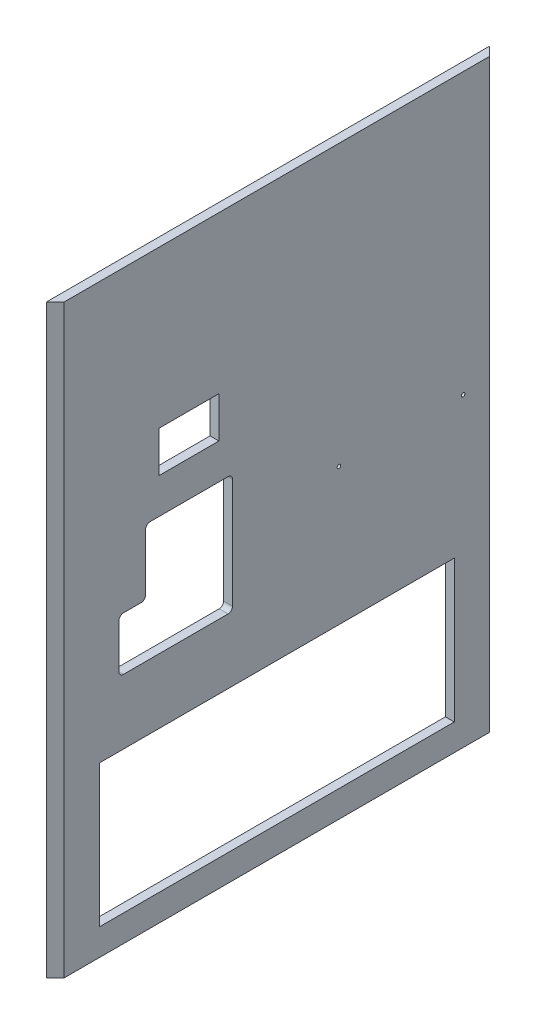
ISO-10303-21;
HEADER;
FILE_DESCRIPTION(('STEP AP214'),'2;1');
FILE_NAME('part.step','',(''),(''),'','','');
FILE_SCHEMA(('AUTOMOTIVE_DESIGN { 1 0 10303 214 1 1 1 1 }'));
ENDSEC;
DATA;
#1=APPLICATION_CONTEXT('core data for automotive mechanical design processes');
#2=APPLICATION_PROTOCOL_DEFINITION('international standard','automotive_design',2000,#1);
#3=PRODUCT_CONTEXT('',#1,'mechanical');
#4=PRODUCT('Part','Part','',(#3));
#5=PRODUCT_RELATED_PRODUCT_CATEGORY('part','',(#4));
#6=PRODUCT_DEFINITION_FORMATION('','',#4);
#7=PRODUCT_DEFINITION_CONTEXT('part definition',#1,'design');
#8=PRODUCT_DEFINITION('design','',#6,#7);
#9=PRODUCT_DEFINITION_SHAPE('','',#8);
#10=(LENGTH_UNIT() NAMED_UNIT(*) SI_UNIT(.MILLI.,.METRE.));
#11=(NAMED_UNIT(*) PLANE_ANGLE_UNIT() SI_UNIT($,.RADIAN.));
#12=(NAMED_UNIT(*) SI_UNIT($,.STERADIAN.) SOLID_ANGLE_UNIT());
#13=UNCERTAINTY_MEASURE_WITH_UNIT(LENGTH_MEASURE(1.E-05),#10,'distance_accuracy_value','');
#14=(GEOMETRIC_REPRESENTATION_CONTEXT(3) GLOBAL_UNCERTAINTY_ASSIGNED_CONTEXT((#13)) GLOBAL_UNIT_ASSIGNED_CONTEXT((#10,
#11,#12)) REPRESENTATION_CONTEXT('',''));
#15=CARTESIAN_POINT('',(0.,0.,0.));
#16=DIRECTION('',(0.,0.,1.));
#17=DIRECTION('',(1.,0.,0.));
#18=AXIS2_PLACEMENT_3D('',#15,#16,#17);
#19=CARTESIAN_POINT('',(0.,330.,0.));
#20=DIRECTION('',(-1.,0.,0.));
#21=DIRECTION('',(0.,0.,1.));
#22=AXIS2_PLACEMENT_3D('',#19,#20,#21);
#23=PLANE('',#22);
#24=CARTESIAN_POINT('',(0.,172.2,-230.));
#25=DIRECTION('',(-1.,0.,0.));
#26=DIRECTION('',(0.,0.,1.));
#27=AXIS2_PLACEMENT_3D('',#24,#25,#26);
#28=CIRCLE('',#27,0.999999999999998);
#29=CARTESIAN_POINT('',(0.,172.2,-229.));
#30=VERTEX_POINT('',#29);
#31=EDGE_CURVE('E227',#30,#30,#28,.F.);
#32=ORIENTED_EDGE('',*,*,#31,.F.);
#33=EDGE_LOOP('',(#32));
#34=FACE_BOUND('',#33,.T.);
#35=CARTESIAN_POINT('',(0.,172.2,-160.));
#36=DIRECTION('',(-1.,0.,0.));
#37=DIRECTION('',(0.,0.,1.));
#38=AXIS2_PLACEMENT_3D('',#35,#36,#37);
#39=CIRCLE('',#38,0.999999999999998);
#40=CARTESIAN_POINT('',(0.,172.2,-159.));
#41=VERTEX_POINT('',#40);
#42=EDGE_CURVE('E220',#41,#41,#39,.F.);
#43=ORIENTED_EDGE('',*,*,#42,.F.);
#44=EDGE_LOOP('',(#43));
#45=FACE_BOUND('',#44,.T.);
#46=DIRECTION('',(0.,0.,1.));
#47=VECTOR('',#46,1.);
#48=CARTESIAN_POINT('',(0.,218.5,-92.3500000000001));
#49=LINE('',#48,#47);
#50=CARTESIAN_POINT('',(0.,218.5,-92.3500000000001));
#51=VERTEX_POINT('',#50);
#52=CARTESIAN_POINT('',(0.,218.5,-58.6500000000001));
#53=VERTEX_POINT('',#52);
#54=EDGE_CURVE('E205',#51,#53,#49,.T.);
#55=ORIENTED_EDGE('',*,*,#54,.T.);
#56=DIRECTION('',(0.,1.,0.));
#57=VECTOR('',#56,1.);
#58=CARTESIAN_POINT('',(0.,218.5,-58.6500000000001));
#59=LINE('',#58,#57);
#60=CARTESIAN_POINT('',(0.,241.6,-58.6500000000001));
#61=VERTEX_POINT('',#60);
#62=EDGE_CURVE('E199',#53,#61,#59,.T.);
#63=ORIENTED_EDGE('',*,*,#62,.T.);
#64=DIRECTION('',(0.,0.,-1.));
#65=VECTOR('',#64,1.);
#66=CARTESIAN_POINT('',(0.,241.6,-58.6500000000001));
#67=LINE('',#66,#65);
#68=CARTESIAN_POINT('',(0.,241.6,-92.3500000000001));
#69=VERTEX_POINT('',#68);
#70=EDGE_CURVE('E208',#61,#69,#67,.T.);
#71=ORIENTED_EDGE('',*,*,#70,.T.);
#72=DIRECTION('',(0.,-1.,0.));
#73=VECTOR('',#72,1.);
#74=CARTESIAN_POINT('',(0.,241.6,-92.3500000000001));
#75=LINE('',#74,#73);
#76=EDGE_CURVE('E52',#69,#51,#75,.T.);
#77=ORIENTED_EDGE('',*,*,#76,.T.);
#78=EDGE_LOOP('',(#55,#63,#71,#77));
#79=FACE_BOUND('',#78,.T.);
#80=DIRECTION('',(0.,0.,-1.));
#81=VECTOR('',#80,1.);
#82=CARTESIAN_POINT('',(0.,161.5,-36.0000000000001));
#83=LINE('',#82,#81);
#84=CARTESIAN_POINT('',(0.,161.5,-38.5000000000001));
#85=VERTEX_POINT('',#84);
#86=CARTESIAN_POINT('',(0.,161.5,-48.5000000000001));
#87=VERTEX_POINT('',#86);
#88=EDGE_CURVE('E244',#85,#87,#83,.T.);
#89=ORIENTED_EDGE('',*,*,#88,.T.);
#90=CARTESIAN_POINT('',(0.,164.,-48.5000000000001));
#91=DIRECTION('',(-1.,0.,0.));
#92=DIRECTION('',(0.,0.,1.));
#93=AXIS2_PLACEMENT_3D('',#90,#91,#92);
#94=CIRCLE('',#93,2.5);
#95=CARTESIAN_POINT('',(0.,164.,-51.0000000000001));
#96=VERTEX_POINT('',#95);
#97=EDGE_CURVE('E360',#87,#96,#94,.F.);
#98=ORIENTED_EDGE('',*,*,#97,.T.);
#99=DIRECTION('',(0.,1.,0.));
#100=VECTOR('',#99,1.);
#101=CARTESIAN_POINT('',(0.,198.5,-51.0000000000001));
#102=LINE('',#101,#100);
#103=CARTESIAN_POINT('',(0.,196.,-51.0000000000001));
#104=VERTEX_POINT('',#103);
#105=EDGE_CURVE('E247',#96,#104,#102,.T.);
#106=ORIENTED_EDGE('',*,*,#105,.T.);
#107=CARTESIAN_POINT('',(0.,196.,-53.5000000000001));
#108=DIRECTION('',(-1.,0.,0.));
#109=DIRECTION('',(0.,0.,1.));
#110=AXIS2_PLACEMENT_3D('',#107,#108,#109);
#111=CIRCLE('',#110,2.5);
#112=CARTESIAN_POINT('',(0.,198.5,-53.5000000000001));
#113=VERTEX_POINT('',#112);
#114=EDGE_CURVE('E377',#104,#113,#111,.T.);
#115=ORIENTED_EDGE('',*,*,#114,.T.);
#116=DIRECTION('',(0.,0.,-1.));
#117=VECTOR('',#116,1.);
#118=CARTESIAN_POINT('',(0.,198.5,-100.));
#119=LINE('',#118,#117);
#120=CARTESIAN_POINT('',(0.,198.5,-97.5000000000001));
#121=VERTEX_POINT('',#120);
#122=EDGE_CURVE('E250',#113,#121,#119,.T.);
#123=ORIENTED_EDGE('',*,*,#122,.T.);
#124=CARTESIAN_POINT('',(0.,196.,-97.5000000000001));
#125=DIRECTION('',(-1.,0.,0.));
#126=DIRECTION('',(0.,0.,1.));
#127=AXIS2_PLACEMENT_3D('',#124,#125,#126);
#128=CIRCLE('',#127,2.5);
#129=CARTESIAN_POINT('',(0.,196.,-100.));
#130=VERTEX_POINT('',#129);
#131=EDGE_CURVE('E373',#121,#130,#128,.T.);
#132=ORIENTED_EDGE('',*,*,#131,.T.);
#133=DIRECTION('',(0.,-1.,0.));
#134=VECTOR('',#133,1.);
#135=CARTESIAN_POINT('',(0.,198.5,-100.));
#136=LINE('',#135,#134);
#137=CARTESIAN_POINT('',(0.,134.,-100.));
#138=VERTEX_POINT('',#137);
#139=EDGE_CURVE('E253',#130,#138,#136,.T.);
#140=ORIENTED_EDGE('',*,*,#139,.T.);
#141=CARTESIAN_POINT('',(0.,134.,-97.5));
#142=DIRECTION('',(-1.,0.,0.));
#143=DIRECTION('',(0.,0.,1.));
#144=AXIS2_PLACEMENT_3D('',#141,#142,#143);
#145=CIRCLE('',#144,2.5);
#146=CARTESIAN_POINT('',(0.,131.5,-97.5));
#147=VERTEX_POINT('',#146);
#148=EDGE_CURVE('E369',#138,#147,#145,.T.);
#149=ORIENTED_EDGE('',*,*,#148,.T.);
#150=DIRECTION('',(0.,0.,1.));
#151=VECTOR('',#150,1.);
#152=CARTESIAN_POINT('',(0.,131.5,-100.));
#153=LINE('',#152,#151);
#154=CARTESIAN_POINT('',(0.,131.5,-38.5000000000001));
#155=VERTEX_POINT('',#154);
#156=EDGE_CURVE('E237',#147,#155,#153,.T.);
#157=ORIENTED_EDGE('',*,*,#156,.T.);
#158=CARTESIAN_POINT('',(0.,134.,-38.5000000000001));
#159=DIRECTION('',(-1.,0.,0.));
#160=DIRECTION('',(0.,0.,1.));
#161=AXIS2_PLACEMENT_3D('',#158,#159,#160);
#162=CIRCLE('',#161,2.5);
#163=CARTESIAN_POINT('',(0.,134.,-36.0000000000001));
#164=VERTEX_POINT('',#163);
#165=EDGE_CURVE('E11',#155,#164,#162,.T.);
#166=ORIENTED_EDGE('',*,*,#165,.T.);
#167=DIRECTION('',(0.,1.,0.));
#168=VECTOR('',#167,1.);
#169=CARTESIAN_POINT('',(0.,131.5,-36.0000000000001));
#170=LINE('',#169,#168);
#171=CARTESIAN_POINT('',(0.,159.,-36.0000000000001));
#172=VERTEX_POINT('',#171);
#173=EDGE_CURVE('E240',#164,#172,#170,.T.);
#174=ORIENTED_EDGE('',*,*,#173,.T.);
#175=CARTESIAN_POINT('',(0.,159.,-38.5000000000001));
#176=DIRECTION('',(-1.,0.,0.));
#177=DIRECTION('',(0.,0.,1.));
#178=AXIS2_PLACEMENT_3D('',#175,#176,#177);
#179=CIRCLE('',#178,2.5);
#180=EDGE_CURVE('E381',#172,#85,#179,.T.);
#181=ORIENTED_EDGE('',*,*,#180,.T.);
#182=EDGE_LOOP('',(#89,#98,#106,#115,#123,#132,#140,#149,#157,#166,#174,#181));
#183=FACE_BOUND('',#182,.T.);
#184=DIRECTION('',(0.,1.,0.));
#185=VECTOR('',#184,1.);
#186=CARTESIAN_POINT('',(0.,15.,-225.));
#187=LINE('',#186,#185);
#188=CARTESIAN_POINT('',(0.,15.,-225.));
#189=VERTEX_POINT('',#188);
#190=CARTESIAN_POINT('',(0.,95.,-225.));
#191=VERTEX_POINT('',#190);
#192=EDGE_CURVE('E274',#189,#191,#187,.T.);
#193=ORIENTED_EDGE('',*,*,#192,.F.);
#194=DIRECTION('',(0.,0.,-1.));
#195=VECTOR('',#194,1.);
#196=CARTESIAN_POINT('',(0.,15.,-25.));
#197=LINE('',#196,#195);
#198=CARTESIAN_POINT('',(0.,15.,-25.));
#199=VERTEX_POINT('',#198);
#200=EDGE_CURVE('E277',#199,#189,#197,.T.);
#201=ORIENTED_EDGE('',*,*,#200,.F.);
#202=DIRECTION('',(0.,-1.,0.));
#203=VECTOR('',#202,1.);
#204=CARTESIAN_POINT('',(0.,95.,-25.));
#205=LINE('',#204,#203);
#206=CARTESIAN_POINT('',(0.,95.,-25.));
#207=VERTEX_POINT('',#206);
#208=EDGE_CURVE('E294',#207,#199,#205,.T.);
#209=ORIENTED_EDGE('',*,*,#208,.F.);
#210=DIRECTION('',(0.,0.,1.));
#211=VECTOR('',#210,1.);
#212=CARTESIAN_POINT('',(0.,95.,-225.));
#213=LINE('',#212,#211);
#214=EDGE_CURVE('E256',#191,#207,#213,.T.);
#215=ORIENTED_EDGE('',*,*,#214,.F.);
#216=EDGE_LOOP('',(#193,#201,#209,#215));
#217=FACE_BOUND('',#216,.T.);
#218=DIRECTION('',(0.,0.,-1.));
#219=VECTOR('',#218,1.);
#220=CARTESIAN_POINT('',(0.,0.,0.));
#221=LINE('',#220,#219);
#222=CARTESIAN_POINT('',(0.,0.,-5.));
#223=VERTEX_POINT('',#222);
#224=CARTESIAN_POINT('',(0.,0.,-245.));
#225=VERTEX_POINT('',#224);
#226=EDGE_CURVE('E312',#223,#225,#221,.T.);
#227=ORIENTED_EDGE('',*,*,#226,.T.);
#228=DIRECTION('',(0.,1.,0.));
#229=VECTOR('',#228,1.);
#230=CARTESIAN_POINT('',(0.,-0.000999999999973245,-245.));
#231=LINE('',#230,#229);
#232=CARTESIAN_POINT('',(0.,330.,-245.));
#233=VERTEX_POINT('',#232);
#234=EDGE_CURVE('E306',#225,#233,#231,.T.);
#235=ORIENTED_EDGE('',*,*,#234,.T.);
#236=DIRECTION('',(0.,0.,-1.));
#237=VECTOR('',#236,1.);
#238=CARTESIAN_POINT('',(0.,330.,0.));
#239=LINE('',#238,#237);
#240=CARTESIAN_POINT('',(0.,330.,-5.));
#241=VERTEX_POINT('',#240);
#242=EDGE_CURVE('E317',#241,#233,#239,.T.);
#243=ORIENTED_EDGE('',*,*,#242,.F.);
#244=DIRECTION('',(0.,1.,0.));
#245=VECTOR('',#244,1.);
#246=CARTESIAN_POINT('',(0.,-0.000999999999973245,-5.));
#247=LINE('',#246,#245);
#248=EDGE_CURVE('E307',#223,#241,#247,.T.);
#249=ORIENTED_EDGE('',*,*,#248,.F.);
#250=EDGE_LOOP('',(#227,#235,#243,#249));
#251=FACE_BOUND('',#250,.T.);
#252=ADVANCED_FACE('F37',(#34,#45,#79,#183,#217,#251),#23,.F.);
#253=CARTESIAN_POINT('',(-5.,330.,-250.));
#254=DIRECTION('',(1.,0.,0.));
#255=DIRECTION('',(0.,0.,-1.));
#256=AXIS2_PLACEMENT_3D('',#253,#254,#255);
#257=PLANE('',#256);
#258=CARTESIAN_POINT('',(-5.,172.2,-230.));
#259=DIRECTION('',(-1.,0.,0.));
#260=DIRECTION('',(0.,0.,1.));
#261=AXIS2_PLACEMENT_3D('',#258,#259,#260);
#262=CIRCLE('',#261,0.999999999999998);
#263=CARTESIAN_POINT('',(-5.,172.2,-229.));
#264=VERTEX_POINT('',#263);
#265=EDGE_CURVE('E523',#264,#264,#262,.T.);
#266=ORIENTED_EDGE('',*,*,#265,.F.);
#267=EDGE_LOOP('',(#266));
#268=FACE_BOUND('',#267,.T.);
#269=CARTESIAN_POINT('',(-4.99999999999999,172.2,-160.));
#270=DIRECTION('',(-1.,0.,0.));
#271=DIRECTION('',(0.,0.,1.));
#272=AXIS2_PLACEMENT_3D('',#269,#270,#271);
#273=CIRCLE('',#272,0.999999999999998);
#274=CARTESIAN_POINT('',(-4.99999999999999,172.2,-159.));
#275=VERTEX_POINT('',#274);
#276=EDGE_CURVE('E527',#275,#275,#273,.T.);
#277=ORIENTED_EDGE('',*,*,#276,.F.);
#278=EDGE_LOOP('',(#277));
#279=FACE_BOUND('',#278,.T.);
#280=DIRECTION('',(0.,0.,-1.));
#281=VECTOR('',#280,1.);
#282=CARTESIAN_POINT('',(-4.99999999999998,241.6,-58.6500000000001));
#283=LINE('',#282,#281);
#284=CARTESIAN_POINT('',(-4.99999999999998,241.6,-58.6500000000001));
#285=VERTEX_POINT('',#284);
#286=CARTESIAN_POINT('',(-4.99999999999998,241.6,-92.3500000000001));
#287=VERTEX_POINT('',#286);
#288=EDGE_CURVE('E226',#285,#287,#283,.T.);
#289=ORIENTED_EDGE('',*,*,#288,.F.);
#290=DIRECTION('',(0.,1.,0.));
#291=VECTOR('',#290,1.);
#292=CARTESIAN_POINT('',(-4.99999999999998,218.5,-58.6500000000001));
#293=LINE('',#292,#291);
#294=CARTESIAN_POINT('',(-4.99999999999998,218.5,-58.6500000000001));
#295=VERTEX_POINT('',#294);
#296=EDGE_CURVE('E60',#295,#285,#293,.T.);
#297=ORIENTED_EDGE('',*,*,#296,.F.);
#298=DIRECTION('',(0.,0.,1.));
#299=VECTOR('',#298,1.);
#300=CARTESIAN_POINT('',(-4.99999999999998,218.5,-92.3500000000001));
#301=LINE('',#300,#299);
#302=CARTESIAN_POINT('',(-4.99999999999998,218.5,-92.3500000000001));
#303=VERTEX_POINT('',#302);
#304=EDGE_CURVE('E214',#303,#295,#301,.T.);
#305=ORIENTED_EDGE('',*,*,#304,.F.);
#306=DIRECTION('',(0.,-1.,0.));
#307=VECTOR('',#306,1.);
#308=CARTESIAN_POINT('',(-4.99999999999998,241.6,-92.3500000000001));
#309=LINE('',#308,#307);
#310=EDGE_CURVE('E217',#287,#303,#309,.T.);
#311=ORIENTED_EDGE('',*,*,#310,.F.);
#312=EDGE_LOOP('',(#289,#297,#305,#311));
#313=FACE_BOUND('',#312,.T.);
#314=DIRECTION('',(0.,1.,0.));
#315=VECTOR('',#314,1.);
#316=CARTESIAN_POINT('',(-4.99999999999998,198.5,-51.0000000000001));
#317=LINE('',#316,#315);
#318=CARTESIAN_POINT('',(-4.99999999999998,164.,-51.0000000000001));
#319=VERTEX_POINT('',#318);
#320=CARTESIAN_POINT('',(-4.99999999999998,196.,-51.0000000000001));
#321=VERTEX_POINT('',#320);
#322=EDGE_CURVE('E265',#319,#321,#317,.T.);
#323=ORIENTED_EDGE('',*,*,#322,.F.);
#324=CARTESIAN_POINT('',(-4.99999999999998,164.,-48.5000000000001));
#325=DIRECTION('',(1.,0.,0.));
#326=DIRECTION('',(0.,0.,-1.));
#327=AXIS2_PLACEMENT_3D('',#324,#325,#326);
#328=CIRCLE('',#327,2.5);
#329=CARTESIAN_POINT('',(-4.99999999999998,161.5,-48.5000000000001));
#330=VERTEX_POINT('',#329);
#331=EDGE_CURVE('E353',#319,#330,#328,.F.);
#332=ORIENTED_EDGE('',*,*,#331,.T.);
#333=DIRECTION('',(0.,0.,-1.));
#334=VECTOR('',#333,1.);
#335=CARTESIAN_POINT('',(-4.99999999999997,161.5,-36.0000000000001));
#336=LINE('',#335,#334);
#337=CARTESIAN_POINT('',(-4.99999999999997,161.5,-38.5000000000001));
#338=VERTEX_POINT('',#337);
#339=EDGE_CURVE('E262',#338,#330,#336,.T.);
#340=ORIENTED_EDGE('',*,*,#339,.F.);
#341=CARTESIAN_POINT('',(-4.99999999999997,159.,-38.5000000000001));
#342=DIRECTION('',(1.,0.,0.));
#343=DIRECTION('',(0.,0.,-1.));
#344=AXIS2_PLACEMENT_3D('',#341,#342,#343);
#345=CIRCLE('',#344,2.5);
#346=CARTESIAN_POINT('',(-4.99999999999997,159.,-36.0000000000001));
#347=VERTEX_POINT('',#346);
#348=EDGE_CURVE('E379',#338,#347,#345,.T.);
#349=ORIENTED_EDGE('',*,*,#348,.T.);
#350=DIRECTION('',(0.,1.,0.));
#351=VECTOR('',#350,1.);
#352=CARTESIAN_POINT('',(-4.99999999999997,131.5,-36.0000000000001));
#353=LINE('',#352,#351);
#354=CARTESIAN_POINT('',(-4.99999999999997,134.,-36.0000000000001));
#355=VERTEX_POINT('',#354);
#356=EDGE_CURVE('E259',#355,#347,#353,.T.);
#357=ORIENTED_EDGE('',*,*,#356,.F.);
#358=CARTESIAN_POINT('',(-4.99999999999997,134.,-38.5000000000001));
#359=DIRECTION('',(1.,0.,0.));
#360=DIRECTION('',(0.,0.,-1.));
#361=AXIS2_PLACEMENT_3D('',#358,#359,#360);
#362=CIRCLE('',#361,2.5);
#363=CARTESIAN_POINT('',(-4.99999999999997,131.5,-38.5000000000001));
#364=VERTEX_POINT('',#363);
#365=EDGE_CURVE('E45',#355,#364,#362,.T.);
#366=ORIENTED_EDGE('',*,*,#365,.T.);
#367=DIRECTION('',(0.,0.,1.));
#368=VECTOR('',#367,1.);
#369=CARTESIAN_POINT('',(-4.99999999999998,131.5,-51.0000000000001));
#370=LINE('',#369,#368);
#371=CARTESIAN_POINT('',(-4.99999999999998,131.5,-97.5));
#372=VERTEX_POINT('',#371);
#373=EDGE_CURVE('E233',#372,#364,#370,.T.);
#374=ORIENTED_EDGE('',*,*,#373,.F.);
#375=CARTESIAN_POINT('',(-4.99999999999998,134.,-97.5));
#376=DIRECTION('',(1.,0.,0.));
#377=DIRECTION('',(0.,0.,-1.));
#378=AXIS2_PLACEMENT_3D('',#375,#376,#377);
#379=CIRCLE('',#378,2.5);
#380=CARTESIAN_POINT('',(-4.99999999999998,134.,-100.));
#381=VERTEX_POINT('',#380);
#382=EDGE_CURVE('E367',#372,#381,#379,.T.);
#383=ORIENTED_EDGE('',*,*,#382,.T.);
#384=DIRECTION('',(0.,-1.,0.));
#385=VECTOR('',#384,1.);
#386=CARTESIAN_POINT('',(-4.99999999999998,198.5,-100.));
#387=LINE('',#386,#385);
#388=CARTESIAN_POINT('',(-4.99999999999998,196.,-100.));
#389=VERTEX_POINT('',#388);
#390=EDGE_CURVE('E241',#389,#381,#387,.T.);
#391=ORIENTED_EDGE('',*,*,#390,.F.);
#392=CARTESIAN_POINT('',(-4.99999999999998,196.,-97.5000000000001));
#393=DIRECTION('',(1.,0.,0.));
#394=DIRECTION('',(0.,0.,-1.));
#395=AXIS2_PLACEMENT_3D('',#392,#393,#394);
#396=CIRCLE('',#395,2.5);
#397=CARTESIAN_POINT('',(-4.99999999999998,198.5,-97.5000000000001));
#398=VERTEX_POINT('',#397);
#399=EDGE_CURVE('E371',#389,#398,#396,.T.);
#400=ORIENTED_EDGE('',*,*,#399,.T.);
#401=DIRECTION('',(0.,0.,-1.));
#402=VECTOR('',#401,1.);
#403=CARTESIAN_POINT('',(-4.99999999999998,198.5,-100.));
#404=LINE('',#403,#402);
#405=CARTESIAN_POINT('',(-4.99999999999998,198.5,-53.5000000000001));
#406=VERTEX_POINT('',#405);
#407=EDGE_CURVE('E268',#406,#398,#404,.T.);
#408=ORIENTED_EDGE('',*,*,#407,.F.);
#409=CARTESIAN_POINT('',(-4.99999999999998,196.,-53.5000000000001));
#410=DIRECTION('',(1.,0.,0.));
#411=DIRECTION('',(0.,0.,-1.));
#412=AXIS2_PLACEMENT_3D('',#409,#410,#411);
#413=CIRCLE('',#412,2.5);
#414=EDGE_CURVE('E375',#406,#321,#413,.T.);
#415=ORIENTED_EDGE('',*,*,#414,.T.);
#416=EDGE_LOOP('',(#323,#332,#340,#349,#357,#366,#374,#383,#391,#400,#408,#415));
#417=FACE_BOUND('',#416,.T.);
#418=DIRECTION('',(0.,1.,0.));
#419=VECTOR('',#418,1.);
#420=CARTESIAN_POINT('',(-4.99999999999997,95.,-25.));
#421=LINE('',#420,#419);
#422=CARTESIAN_POINT('',(-4.99999999999997,15.,-25.));
#423=VERTEX_POINT('',#422);
#424=CARTESIAN_POINT('',(-4.99999999999997,95.,-25.));
#425=VERTEX_POINT('',#424);
#426=EDGE_CURVE('E282',#423,#425,#421,.T.);
#427=ORIENTED_EDGE('',*,*,#426,.F.);
#428=DIRECTION('',(0.,0.,1.));
#429=VECTOR('',#428,1.);
#430=CARTESIAN_POINT('',(-4.99999999999997,15.,-25.));
#431=LINE('',#430,#429);
#432=CARTESIAN_POINT('',(-5.,15.,-225.));
#433=VERTEX_POINT('',#432);
#434=EDGE_CURVE('E280',#433,#423,#431,.T.);
#435=ORIENTED_EDGE('',*,*,#434,.F.);
#436=DIRECTION('',(0.,-1.,0.));
#437=VECTOR('',#436,1.);
#438=CARTESIAN_POINT('',(-5.,15.,-225.));
#439=LINE('',#438,#437);
#440=CARTESIAN_POINT('',(-5.,95.,-225.));
#441=VERTEX_POINT('',#440);
#442=EDGE_CURVE('E288',#441,#433,#439,.T.);
#443=ORIENTED_EDGE('',*,*,#442,.F.);
#444=DIRECTION('',(0.,0.,-1.));
#445=VECTOR('',#444,1.);
#446=CARTESIAN_POINT('',(-5.,95.,-225.));
#447=LINE('',#446,#445);
#448=EDGE_CURVE('E285',#425,#441,#447,.T.);
#449=ORIENTED_EDGE('',*,*,#448,.F.);
#450=EDGE_LOOP('',(#427,#435,#443,#449));
#451=FACE_BOUND('',#450,.T.);
#452=DIRECTION('',(0.,0.,1.));
#453=VECTOR('',#452,1.);
#454=CARTESIAN_POINT('',(-5.,0.,-250.));
#455=LINE('',#454,#453);
#456=CARTESIAN_POINT('',(-5.,0.,-250.));
#457=VERTEX_POINT('',#456);
#458=CARTESIAN_POINT('',(-4.99999999999997,0.,0.));
#459=VERTEX_POINT('',#458);
#460=EDGE_CURVE('E321',#457,#459,#455,.T.);
#461=ORIENTED_EDGE('',*,*,#460,.T.);
#462=DIRECTION('',(0.,-1.,0.));
#463=VECTOR('',#462,1.);
#464=CARTESIAN_POINT('',(-4.99999999999997,330.,0.));
#465=LINE('',#464,#463);
#466=CARTESIAN_POINT('',(-4.99999999999997,330.,0.));
#467=VERTEX_POINT('',#466);
#468=EDGE_CURVE('E324',#467,#459,#465,.T.);
#469=ORIENTED_EDGE('',*,*,#468,.F.);
#470=DIRECTION('',(0.,0.,1.));
#471=VECTOR('',#470,1.);
#472=CARTESIAN_POINT('',(-5.,330.,-250.));
#473=LINE('',#472,#471);
#474=CARTESIAN_POINT('',(-5.,330.,-250.));
#475=VERTEX_POINT('',#474);
#476=EDGE_CURVE('E320',#475,#467,#473,.T.);
#477=ORIENTED_EDGE('',*,*,#476,.F.);
#478=DIRECTION('',(0.,-1.,0.));
#479=VECTOR('',#478,1.);
#480=CARTESIAN_POINT('',(-5.,330.,-250.));
#481=LINE('',#480,#479);
#482=EDGE_CURVE('E330',#475,#457,#481,.T.);
#483=ORIENTED_EDGE('',*,*,#482,.T.);
#484=EDGE_LOOP('',(#461,#469,#477,#483));
#485=FACE_BOUND('',#484,.T.);
#486=ADVANCED_FACE('F386',(#268,#279,#313,#417,#451,#485),#257,.F.);
#487=CARTESIAN_POINT('',(0.,330.,0.));
#488=DIRECTION('',(0.,1.,0.));
#489=DIRECTION('',(0.,0.,1.));
#490=AXIS2_PLACEMENT_3D('',#487,#488,#489);
#491=PLANE('',#490);
#492=DIRECTION('',(0.707106781186547,0.,0.707106781186548));
#493=VECTOR('',#492,1.);
#494=CARTESIAN_POINT('',(0.,330.,-245.));
#495=LINE('',#494,#493);
#496=EDGE_CURVE('E304',#475,#233,#495,.T.);
#497=ORIENTED_EDGE('',*,*,#496,.F.);
#498=ORIENTED_EDGE('',*,*,#476,.T.);
#499=DIRECTION('',(-0.707106781186545,0.,0.70710678118655));
#500=VECTOR('',#499,1.);
#501=CARTESIAN_POINT('',(-4.99999999999997,330.,0.));
#502=LINE('',#501,#500);
#503=EDGE_CURVE('E314',#241,#467,#502,.T.);
#504=ORIENTED_EDGE('',*,*,#503,.F.);
#505=ORIENTED_EDGE('',*,*,#242,.T.);
#506=EDGE_LOOP('',(#497,#498,#504,#505));
#507=FACE_BOUND('',#506,.T.);
#508=ADVANCED_FACE('F454',(#507),#491,.T.);
#509=CARTESIAN_POINT('',(0.,0.,0.));
#510=DIRECTION('',(0.,1.,0.));
#511=DIRECTION('',(0.,0.,1.));
#512=AXIS2_PLACEMENT_3D('',#509,#510,#511);
#513=PLANE('',#512);
#514=ORIENTED_EDGE('',*,*,#460,.F.);
#515=DIRECTION('',(-0.707106781186547,0.,-0.707106781186548));
#516=VECTOR('',#515,1.);
#517=CARTESIAN_POINT('',(0.,0.,-245.));
#518=LINE('',#517,#516);
#519=EDGE_CURVE('E310',#225,#457,#518,.T.);
#520=ORIENTED_EDGE('',*,*,#519,.F.);
#521=ORIENTED_EDGE('',*,*,#226,.F.);
#522=DIRECTION('',(0.707106781186545,0.,-0.70710678118655));
#523=VECTOR('',#522,1.);
#524=CARTESIAN_POINT('',(-4.99999999999997,0.,0.));
#525=LINE('',#524,#523);
#526=EDGE_CURVE('E303',#459,#223,#525,.T.);
#527=ORIENTED_EDGE('',*,*,#526,.F.);
#528=EDGE_LOOP('',(#514,#520,#521,#527));
#529=FACE_BOUND('',#528,.T.);
#530=ADVANCED_FACE('F460',(#529),#513,.F.);
#531=CARTESIAN_POINT('',(-4.99999999999997,-0.000999999999973245,0.));
#532=DIRECTION('',(-0.70710678118655,0.,-0.707106781186545));
#533=DIRECTION('',(-0.707106781186545,0.,0.70710678118655));
#534=AXIS2_PLACEMENT_3D('',#531,#532,#533);
#535=PLANE('',#534);
#536=ORIENTED_EDGE('',*,*,#526,.T.);
#537=ORIENTED_EDGE('',*,*,#248,.T.);
#538=ORIENTED_EDGE('',*,*,#503,.T.);
#539=ORIENTED_EDGE('',*,*,#468,.T.);
#540=EDGE_LOOP('',(#536,#537,#538,#539));
#541=FACE_BOUND('',#540,.T.);
#542=ADVANCED_FACE('F463',(#541),#535,.F.);
#543=CARTESIAN_POINT('',(0.,-0.000999999999973245,-245.));
#544=DIRECTION('',(-0.707106781186548,0.,0.707106781186547));
#545=DIRECTION('',(0.707106781186547,0.,0.707106781186548));
#546=AXIS2_PLACEMENT_3D('',#543,#544,#545);
#547=PLANE('',#546);
#548=ORIENTED_EDGE('',*,*,#519,.T.);
#549=ORIENTED_EDGE('',*,*,#482,.F.);
#550=ORIENTED_EDGE('',*,*,#496,.T.);
#551=ORIENTED_EDGE('',*,*,#234,.F.);
#552=EDGE_LOOP('',(#548,#549,#550,#551));
#553=FACE_BOUND('',#552,.T.);
#554=ADVANCED_FACE('F470',(#553),#547,.F.);
#555=CARTESIAN_POINT('',(0.00100000000002876,15.,-25.));
#556=DIRECTION('',(0.,-1.,0.));
#557=DIRECTION('',(0.,0.,-1.));
#558=AXIS2_PLACEMENT_3D('',#555,#556,#557);
#559=PLANE('',#558);
#560=ORIENTED_EDGE('',*,*,#200,.T.);
#561=DIRECTION('',(-1.,0.,0.));
#562=VECTOR('',#561,1.);
#563=CARTESIAN_POINT('',(0.0010000000000036,15.,-225.));
#564=LINE('',#563,#562);
#565=EDGE_CURVE('E292',#189,#433,#564,.T.);
#566=ORIENTED_EDGE('',*,*,#565,.T.);
#567=ORIENTED_EDGE('',*,*,#434,.T.);
#568=DIRECTION('',(-1.,0.,0.));
#569=VECTOR('',#568,1.);
#570=CARTESIAN_POINT('',(0.00100000000002876,15.,-25.));
#571=LINE('',#570,#569);
#572=EDGE_CURVE('E291',#199,#423,#571,.T.);
#573=ORIENTED_EDGE('',*,*,#572,.F.);
#574=EDGE_LOOP('',(#560,#566,#567,#573));
#575=FACE_BOUND('',#574,.T.);
#576=ADVANCED_FACE('F474',(#575),#559,.F.);
#577=CARTESIAN_POINT('',(0.0010000000000036,15.,-225.));
#578=DIRECTION('',(0.,0.,-1.));
#579=DIRECTION('',(-1.,0.,0.));
#580=AXIS2_PLACEMENT_3D('',#577,#578,#579);
#581=PLANE('',#580);
#582=ORIENTED_EDGE('',*,*,#192,.T.);
#583=DIRECTION('',(-1.,0.,0.));
#584=VECTOR('',#583,1.);
#585=CARTESIAN_POINT('',(0.0010000000000036,95.,-225.));
#586=LINE('',#585,#584);
#587=EDGE_CURVE('E295',#191,#441,#586,.T.);
#588=ORIENTED_EDGE('',*,*,#587,.T.);
#589=ORIENTED_EDGE('',*,*,#442,.T.);
#590=ORIENTED_EDGE('',*,*,#565,.F.);
#591=EDGE_LOOP('',(#582,#588,#589,#590));
#592=FACE_BOUND('',#591,.T.);
#593=ADVANCED_FACE('F478',(#592),#581,.F.);
#594=CARTESIAN_POINT('',(0.0010000000000036,95.,-225.));
#595=DIRECTION('',(0.,1.,0.));
#596=DIRECTION('',(0.,0.,1.));
#597=AXIS2_PLACEMENT_3D('',#594,#595,#596);
#598=PLANE('',#597);
#599=ORIENTED_EDGE('',*,*,#214,.T.);
#600=DIRECTION('',(-1.,0.,0.));
#601=VECTOR('',#600,1.);
#602=CARTESIAN_POINT('',(0.00100000000002789,95.,-25.));
#603=LINE('',#602,#601);
#604=EDGE_CURVE('E297',#207,#425,#603,.T.);
#605=ORIENTED_EDGE('',*,*,#604,.T.);
#606=ORIENTED_EDGE('',*,*,#448,.T.);
#607=ORIENTED_EDGE('',*,*,#587,.F.);
#608=EDGE_LOOP('',(#599,#605,#606,#607));
#609=FACE_BOUND('',#608,.T.);
#610=ADVANCED_FACE('F483',(#609),#598,.F.);
#611=CARTESIAN_POINT('',(0.00100000000002789,95.,-25.));
#612=DIRECTION('',(0.,0.,1.));
#613=DIRECTION('',(0.,-1.,0.));
#614=AXIS2_PLACEMENT_3D('',#611,#612,#613);
#615=PLANE('',#614);
#616=ORIENTED_EDGE('',*,*,#208,.T.);
#617=ORIENTED_EDGE('',*,*,#572,.T.);
#618=ORIENTED_EDGE('',*,*,#426,.T.);
#619=ORIENTED_EDGE('',*,*,#604,.F.);
#620=EDGE_LOOP('',(#616,#617,#618,#619));
#621=FACE_BOUND('',#620,.T.);
#622=ADVANCED_FACE('F480',(#621),#615,.F.);
#623=CARTESIAN_POINT('',(0.,198.5,-100.));
#624=DIRECTION('',(0.,0.,-1.));
#625=DIRECTION('',(0.,1.,0.));
#626=AXIS2_PLACEMENT_3D('',#623,#624,#625);
#627=PLANE('',#626);
#628=ORIENTED_EDGE('',*,*,#390,.T.);
#629=DIRECTION('',(-1.,0.,0.));
#630=VECTOR('',#629,1.);
#631=CARTESIAN_POINT('',(0.,134.,-100.));
#632=LINE('',#631,#630);
#633=EDGE_CURVE('E341',#381,#138,#632,.F.);
#634=ORIENTED_EDGE('',*,*,#633,.T.);
#635=ORIENTED_EDGE('',*,*,#139,.F.);
#636=DIRECTION('',(-1.,0.,0.));
#637=VECTOR('',#636,1.);
#638=CARTESIAN_POINT('',(-4.99999999999998,196.,-100.));
#639=LINE('',#638,#637);
#640=EDGE_CURVE('E338',#130,#389,#639,.T.);
#641=ORIENTED_EDGE('',*,*,#640,.T.);
#642=EDGE_LOOP('',(#628,#634,#635,#641));
#643=FACE_BOUND('',#642,.T.);
#644=ADVANCED_FACE('F434',(#643),#627,.F.);
#645=CARTESIAN_POINT('',(0.,198.5,-100.));
#646=DIRECTION('',(0.,1.,0.));
#647=DIRECTION('',(0.,0.,1.));
#648=AXIS2_PLACEMENT_3D('',#645,#646,#647);
#649=PLANE('',#648);
#650=ORIENTED_EDGE('',*,*,#407,.T.);
#651=DIRECTION('',(-1.,0.,0.));
#652=VECTOR('',#651,1.);
#653=CARTESIAN_POINT('',(0.,198.5,-97.5000000000001));
#654=LINE('',#653,#652);
#655=EDGE_CURVE('E346',#398,#121,#654,.F.);
#656=ORIENTED_EDGE('',*,*,#655,.T.);
#657=ORIENTED_EDGE('',*,*,#122,.F.);
#658=DIRECTION('',(-1.,0.,0.));
#659=VECTOR('',#658,1.);
#660=CARTESIAN_POINT('',(-4.99999999999998,198.5,-53.5000000000001));
#661=LINE('',#660,#659);
#662=EDGE_CURVE('E343',#113,#406,#661,.T.);
#663=ORIENTED_EDGE('',*,*,#662,.T.);
#664=EDGE_LOOP('',(#650,#656,#657,#663));
#665=FACE_BOUND('',#664,.T.);
#666=ADVANCED_FACE('F425',(#665),#649,.F.);
#667=CARTESIAN_POINT('',(0.,198.5,-51.0000000000001));
#668=DIRECTION('',(0.,0.,1.));
#669=DIRECTION('',(0.,-1.,0.));
#670=AXIS2_PLACEMENT_3D('',#667,#668,#669);
#671=PLANE('',#670);
#672=ORIENTED_EDGE('',*,*,#322,.T.);
#673=DIRECTION('',(-1.,0.,0.));
#674=VECTOR('',#673,1.);
#675=CARTESIAN_POINT('',(0.,196.,-51.0000000000001));
#676=LINE('',#675,#674);
#677=EDGE_CURVE('E351',#321,#104,#676,.F.);
#678=ORIENTED_EDGE('',*,*,#677,.T.);
#679=ORIENTED_EDGE('',*,*,#105,.F.);
#680=DIRECTION('',(-1.,0.,0.));
#681=VECTOR('',#680,1.);
#682=CARTESIAN_POINT('',(0.,164.,-51.0000000000001));
#683=LINE('',#682,#681);
#684=EDGE_CURVE('E348',#96,#319,#683,.T.);
#685=ORIENTED_EDGE('',*,*,#684,.T.);
#686=EDGE_LOOP('',(#672,#678,#679,#685));
#687=FACE_BOUND('',#686,.T.);
#688=ADVANCED_FACE('F417',(#687),#671,.F.);
#689=CARTESIAN_POINT('',(0.,161.5,-36.0000000000001));
#690=DIRECTION('',(0.,1.,0.));
#691=DIRECTION('',(0.,0.,1.));
#692=AXIS2_PLACEMENT_3D('',#689,#690,#691);
#693=PLANE('',#692);
#694=ORIENTED_EDGE('',*,*,#339,.T.);
#695=DIRECTION('',(-1.,0.,0.));
#696=VECTOR('',#695,1.);
#697=CARTESIAN_POINT('',(0.,161.5,-48.5000000000001));
#698=LINE('',#697,#696);
#699=EDGE_CURVE('E358',#330,#87,#698,.F.);
#700=ORIENTED_EDGE('',*,*,#699,.T.);
#701=ORIENTED_EDGE('',*,*,#88,.F.);
#702=DIRECTION('',(-1.,0.,0.));
#703=VECTOR('',#702,1.);
#704=CARTESIAN_POINT('',(-4.99999999999997,161.5,-38.5000000000001));
#705=LINE('',#704,#703);
#706=EDGE_CURVE('E355',#85,#338,#705,.T.);
#707=ORIENTED_EDGE('',*,*,#706,.T.);
#708=EDGE_LOOP('',(#694,#700,#701,#707));
#709=FACE_BOUND('',#708,.T.);
#710=ADVANCED_FACE('F408',(#709),#693,.F.);
#711=CARTESIAN_POINT('',(0.,131.5,-36.0000000000001));
#712=DIRECTION('',(0.,0.,1.));
#713=DIRECTION('',(1.,0.,0.));
#714=AXIS2_PLACEMENT_3D('',#711,#712,#713);
#715=PLANE('',#714);
#716=ORIENTED_EDGE('',*,*,#356,.T.);
#717=DIRECTION('',(-1.,0.,0.));
#718=VECTOR('',#717,1.);
#719=CARTESIAN_POINT('',(0.,159.,-36.0000000000001));
#720=LINE('',#719,#718);
#721=EDGE_CURVE('E365',#347,#172,#720,.F.);
#722=ORIENTED_EDGE('',*,*,#721,.T.);
#723=ORIENTED_EDGE('',*,*,#173,.F.);
#724=DIRECTION('',(-1.,0.,0.));
#725=VECTOR('',#724,1.);
#726=CARTESIAN_POINT('',(-4.99999999999997,134.,-36.0000000000001));
#727=LINE('',#726,#725);
#728=EDGE_CURVE('E362',#164,#355,#727,.T.);
#729=ORIENTED_EDGE('',*,*,#728,.T.);
#730=EDGE_LOOP('',(#716,#722,#723,#729));
#731=FACE_BOUND('',#730,.T.);
#732=ADVANCED_FACE('F400',(#731),#715,.F.);
#733=CARTESIAN_POINT('',(0.,131.5,-51.0000000000001));
#734=DIRECTION('',(0.,-1.,0.));
#735=DIRECTION('',(0.,0.,-1.));
#736=AXIS2_PLACEMENT_3D('',#733,#734,#735);
#737=PLANE('',#736);
#738=ORIENTED_EDGE('',*,*,#156,.F.);
#739=DIRECTION('',(-1.,0.,0.));
#740=VECTOR('',#739,1.);
#741=CARTESIAN_POINT('',(-4.99999999999998,131.5,-97.5));
#742=LINE('',#741,#740);
#743=EDGE_CURVE('E335',#147,#372,#742,.T.);
#744=ORIENTED_EDGE('',*,*,#743,.T.);
#745=ORIENTED_EDGE('',*,*,#373,.T.);
#746=DIRECTION('',(-1.,0.,0.));
#747=VECTOR('',#746,1.);
#748=CARTESIAN_POINT('',(0.,131.5,-38.5000000000001));
#749=LINE('',#748,#747);
#750=EDGE_CURVE('E333',#364,#155,#749,.F.);
#751=ORIENTED_EDGE('',*,*,#750,.T.);
#752=EDGE_LOOP('',(#738,#744,#745,#751));
#753=FACE_BOUND('',#752,.T.);
#754=ADVANCED_FACE('F393',(#753),#737,.F.);
#755=CARTESIAN_POINT('',(0.,134.,-97.5));
#756=DIRECTION('',(1.,0.,0.));
#757=DIRECTION('',(0.,0.,-1.));
#758=AXIS2_PLACEMENT_3D('',#755,#756,#757);
#759=CYLINDRICAL_SURFACE('',#758,2.5);
#760=ORIENTED_EDGE('',*,*,#148,.F.);
#761=ORIENTED_EDGE('',*,*,#633,.F.);
#762=ORIENTED_EDGE('',*,*,#382,.F.);
#763=ORIENTED_EDGE('',*,*,#743,.F.);
#764=EDGE_LOOP('',(#760,#761,#762,#763));
#765=FACE_BOUND('',#764,.T.);
#766=ADVANCED_FACE('F438',(#765),#759,.F.);
#767=CARTESIAN_POINT('',(0.,196.,-97.5000000000001));
#768=DIRECTION('',(1.,0.,0.));
#769=DIRECTION('',(0.,0.,-1.));
#770=AXIS2_PLACEMENT_3D('',#767,#768,#769);
#771=CYLINDRICAL_SURFACE('',#770,2.5);
#772=ORIENTED_EDGE('',*,*,#131,.F.);
#773=ORIENTED_EDGE('',*,*,#655,.F.);
#774=ORIENTED_EDGE('',*,*,#399,.F.);
#775=ORIENTED_EDGE('',*,*,#640,.F.);
#776=EDGE_LOOP('',(#772,#773,#774,#775));
#777=FACE_BOUND('',#776,.T.);
#778=ADVANCED_FACE('F429',(#777),#771,.F.);
#779=CARTESIAN_POINT('',(0.,196.,-53.5000000000001));
#780=DIRECTION('',(1.,0.,0.));
#781=DIRECTION('',(0.,0.,-1.));
#782=AXIS2_PLACEMENT_3D('',#779,#780,#781);
#783=CYLINDRICAL_SURFACE('',#782,2.5);
#784=ORIENTED_EDGE('',*,*,#114,.F.);
#785=ORIENTED_EDGE('',*,*,#677,.F.);
#786=ORIENTED_EDGE('',*,*,#414,.F.);
#787=ORIENTED_EDGE('',*,*,#662,.F.);
#788=EDGE_LOOP('',(#784,#785,#786,#787));
#789=FACE_BOUND('',#788,.T.);
#790=ADVANCED_FACE('F420',(#789),#783,.F.);
#791=CARTESIAN_POINT('',(0.,164.,-48.5000000000001));
#792=DIRECTION('',(-1.,0.,0.));
#793=DIRECTION('',(0.,0.,1.));
#794=AXIS2_PLACEMENT_3D('',#791,#792,#793);
#795=CYLINDRICAL_SURFACE('',#794,2.5);
#796=ORIENTED_EDGE('',*,*,#97,.F.);
#797=ORIENTED_EDGE('',*,*,#699,.F.);
#798=ORIENTED_EDGE('',*,*,#331,.F.);
#799=ORIENTED_EDGE('',*,*,#684,.F.);
#800=EDGE_LOOP('',(#796,#797,#798,#799));
#801=FACE_BOUND('',#800,.T.);
#802=ADVANCED_FACE('F412',(#801),#795,.T.);
#803=CARTESIAN_POINT('',(0.,159.,-38.5000000000001));
#804=DIRECTION('',(1.,0.,0.));
#805=DIRECTION('',(0.,0.,-1.));
#806=AXIS2_PLACEMENT_3D('',#803,#804,#805);
#807=CYLINDRICAL_SURFACE('',#806,2.5);
#808=ORIENTED_EDGE('',*,*,#180,.F.);
#809=ORIENTED_EDGE('',*,*,#721,.F.);
#810=ORIENTED_EDGE('',*,*,#348,.F.);
#811=ORIENTED_EDGE('',*,*,#706,.F.);
#812=EDGE_LOOP('',(#808,#809,#810,#811));
#813=FACE_BOUND('',#812,.T.);
#814=ADVANCED_FACE('F403',(#813),#807,.F.);
#815=CARTESIAN_POINT('',(0.,134.,-38.5000000000001));
#816=DIRECTION('',(1.,0.,0.));
#817=DIRECTION('',(0.,0.,-1.));
#818=AXIS2_PLACEMENT_3D('',#815,#816,#817);
#819=CYLINDRICAL_SURFACE('',#818,2.5);
#820=ORIENTED_EDGE('',*,*,#165,.F.);
#821=ORIENTED_EDGE('',*,*,#750,.F.);
#822=ORIENTED_EDGE('',*,*,#365,.F.);
#823=ORIENTED_EDGE('',*,*,#728,.F.);
#824=EDGE_LOOP('',(#820,#821,#822,#823));
#825=FACE_BOUND('',#824,.T.);
#826=ADVANCED_FACE('F39',(#825),#819,.F.);
#827=CARTESIAN_POINT('',(0.,218.5,-58.6500000000001));
#828=DIRECTION('',(0.,0.,1.));
#829=DIRECTION('',(0.,-1.,0.));
#830=AXIS2_PLACEMENT_3D('',#827,#828,#829);
#831=PLANE('',#830);
#832=ORIENTED_EDGE('',*,*,#296,.T.);
#833=DIRECTION('',(-1.,0.,0.));
#834=VECTOR('',#833,1.);
#835=CARTESIAN_POINT('',(0.,241.6,-58.6500000000001));
#836=LINE('',#835,#834);
#837=EDGE_CURVE('E195',#61,#285,#836,.T.);
#838=ORIENTED_EDGE('',*,*,#837,.F.);
#839=ORIENTED_EDGE('',*,*,#62,.F.);
#840=DIRECTION('',(-1.,0.,0.));
#841=VECTOR('',#840,1.);
#842=CARTESIAN_POINT('',(0.,218.5,-58.6500000000001));
#843=LINE('',#842,#841);
#844=EDGE_CURVE('E231',#53,#295,#843,.T.);
#845=ORIENTED_EDGE('',*,*,#844,.T.);
#846=EDGE_LOOP('',(#832,#838,#839,#845));
#847=FACE_BOUND('',#846,.T.);
#848=ADVANCED_FACE('F197',(#847),#831,.F.);
#849=CARTESIAN_POINT('',(0.,218.5,-92.3500000000001));
#850=DIRECTION('',(0.,-1.,0.));
#851=DIRECTION('',(0.,0.,-1.));
#852=AXIS2_PLACEMENT_3D('',#849,#850,#851);
#853=PLANE('',#852);
#854=ORIENTED_EDGE('',*,*,#304,.T.);
#855=ORIENTED_EDGE('',*,*,#844,.F.);
#856=ORIENTED_EDGE('',*,*,#54,.F.);
#857=DIRECTION('',(-1.,0.,0.));
#858=VECTOR('',#857,1.);
#859=CARTESIAN_POINT('',(0.,218.5,-92.3500000000001));
#860=LINE('',#859,#858);
#861=EDGE_CURVE('E234',#51,#303,#860,.T.);
#862=ORIENTED_EDGE('',*,*,#861,.T.);
#863=EDGE_LOOP('',(#854,#855,#856,#862));
#864=FACE_BOUND('',#863,.T.);
#865=ADVANCED_FACE('F503',(#864),#853,.F.);
#866=CARTESIAN_POINT('',(0.,241.6,-92.3500000000001));
#867=DIRECTION('',(0.,0.,-1.));
#868=DIRECTION('',(-1.,0.,0.));
#869=AXIS2_PLACEMENT_3D('',#866,#867,#868);
#870=PLANE('',#869);
#871=ORIENTED_EDGE('',*,*,#310,.T.);
#872=ORIENTED_EDGE('',*,*,#861,.F.);
#873=ORIENTED_EDGE('',*,*,#76,.F.);
#874=DIRECTION('',(-1.,0.,0.));
#875=VECTOR('',#874,1.);
#876=CARTESIAN_POINT('',(0.,241.6,-92.3500000000001));
#877=LINE('',#876,#875);
#878=EDGE_CURVE('E204',#69,#287,#877,.T.);
#879=ORIENTED_EDGE('',*,*,#878,.T.);
#880=EDGE_LOOP('',(#871,#872,#873,#879));
#881=FACE_BOUND('',#880,.T.);
#882=ADVANCED_FACE('F506',(#881),#870,.F.);
#883=CARTESIAN_POINT('',(0.,241.6,-58.6500000000001));
#884=DIRECTION('',(0.,1.,0.));
#885=DIRECTION('',(0.,0.,1.));
#886=AXIS2_PLACEMENT_3D('',#883,#884,#885);
#887=PLANE('',#886);
#888=ORIENTED_EDGE('',*,*,#288,.T.);
#889=ORIENTED_EDGE('',*,*,#878,.F.);
#890=ORIENTED_EDGE('',*,*,#70,.F.);
#891=ORIENTED_EDGE('',*,*,#837,.T.);
#892=EDGE_LOOP('',(#888,#889,#890,#891));
#893=FACE_BOUND('',#892,.T.);
#894=ADVANCED_FACE('F209',(#893),#887,.F.);
#895=CARTESIAN_POINT('',(0.00100000000006172,172.2,-160.));
#896=DIRECTION('',(-1.,0.,0.));
#897=DIRECTION('',(0.,0.,1.));
#898=AXIS2_PLACEMENT_3D('',#895,#896,#897);
#899=CYLINDRICAL_SURFACE('',#898,0.999999999999998);
#900=ORIENTED_EDGE('',*,*,#276,.T.);
#901=EDGE_LOOP('',(#900));
#902=FACE_BOUND('',#901,.T.);
#903=ORIENTED_EDGE('',*,*,#42,.T.);
#904=EDGE_LOOP('',(#903));
#905=FACE_BOUND('',#904,.T.);
#906=ADVANCED_FACE('F505',(#902,#905),#899,.F.);
#907=CARTESIAN_POINT('',(0.00100000000005304,172.2,-230.));
#908=DIRECTION('',(-1.,0.,0.));
#909=DIRECTION('',(0.,0.,1.));
#910=AXIS2_PLACEMENT_3D('',#907,#908,#909);
#911=CYLINDRICAL_SURFACE('',#910,0.999999999999998);
#912=ORIENTED_EDGE('',*,*,#265,.T.);
#913=EDGE_LOOP('',(#912));
#914=FACE_BOUND('',#913,.T.);
#915=ORIENTED_EDGE('',*,*,#31,.T.);
#916=EDGE_LOOP('',(#915));
#917=FACE_BOUND('',#916,.T.);
#918=ADVANCED_FACE('F514',(#914,#917),#911,.F.);
#919=CLOSED_SHELL('',(#252,#486,#508,#530,#542,#554,#576,#593,#610,#622,#644,#666,#688,#710,
#732,#754,#766,#778,#790,#802,#814,#826,#848,#865,#882,#894,#906,#918));
#920=MANIFOLD_SOLID_BREP('B2',#919);
#921=ADVANCED_BREP_SHAPE_REPRESENTATION('',(#18,#920),#14);
#922=SHAPE_DEFINITION_REPRESENTATION(#9,#921);
ENDSEC;
END-ISO-10303-21;
